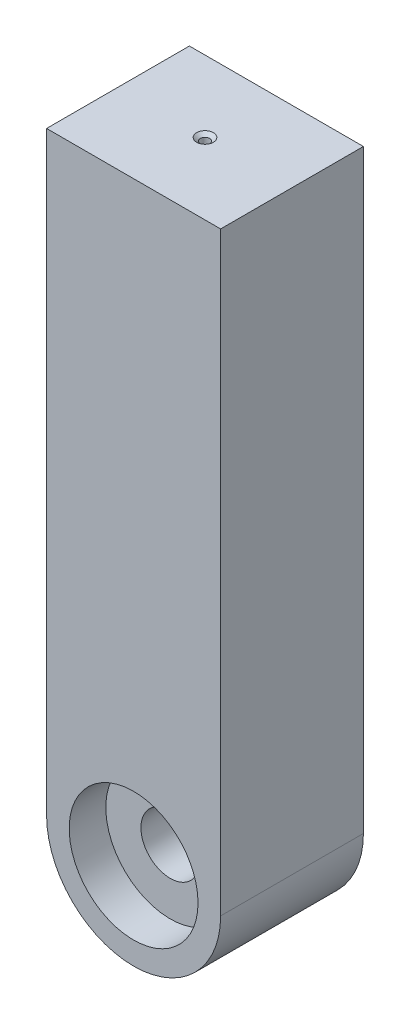
ISO-10303-21;
HEADER;
FILE_DESCRIPTION(('STEP AP214'),'2;1');
FILE_NAME('part.step','',(''),(''),'','','');
FILE_SCHEMA(('AUTOMOTIVE_DESIGN { 1 0 10303 214 1 1 1 1 }'));
ENDSEC;
DATA;
#1=APPLICATION_CONTEXT('core data for automotive mechanical design processes');
#2=APPLICATION_PROTOCOL_DEFINITION('international standard','automotive_design',2000,#1);
#3=PRODUCT_CONTEXT('',#1,'mechanical');
#4=PRODUCT('Part','Part','',(#3));
#5=PRODUCT_RELATED_PRODUCT_CATEGORY('part','',(#4));
#6=PRODUCT_DEFINITION_FORMATION('','',#4);
#7=PRODUCT_DEFINITION_CONTEXT('part definition',#1,'design');
#8=PRODUCT_DEFINITION('design','',#6,#7);
#9=PRODUCT_DEFINITION_SHAPE('','',#8);
#10=(LENGTH_UNIT() NAMED_UNIT(*) SI_UNIT(.MILLI.,.METRE.));
#11=(NAMED_UNIT(*) PLANE_ANGLE_UNIT() SI_UNIT($,.RADIAN.));
#12=(NAMED_UNIT(*) SI_UNIT($,.STERADIAN.) SOLID_ANGLE_UNIT());
#13=UNCERTAINTY_MEASURE_WITH_UNIT(LENGTH_MEASURE(1.E-05),#10,'distance_accuracy_value','');
#14=(GEOMETRIC_REPRESENTATION_CONTEXT(3) GLOBAL_UNCERTAINTY_ASSIGNED_CONTEXT((#13)) GLOBAL_UNIT_ASSIGNED_CONTEXT((#10,
#11,#12)) REPRESENTATION_CONTEXT('',''));
#15=CARTESIAN_POINT('',(0.,0.,0.));
#16=DIRECTION('',(0.,0.,1.));
#17=DIRECTION('',(1.,0.,0.));
#18=AXIS2_PLACEMENT_3D('',#15,#16,#17);
#19=CARTESIAN_POINT('',(0.,101.6,12.192));
#20=DIRECTION('',(0.,1.,0.));
#21=DIRECTION('',(0.,0.,1.));
#22=AXIS2_PLACEMENT_3D('',#19,#20,#21);
#23=CYLINDRICAL_SURFACE('',#22,0.793749999999987);
#24=CARTESIAN_POINT('',(0.,-5.,12.98575));
#25=CARTESIAN_POINT('',(0.0442868029784821,-4.99999926306734,12.9857481986608));
#26=CARTESIAN_POINT('',(0.0885985221211616,-4.9994054564783,12.9820310497521));
#27=CARTESIAN_POINT('',(0.175981215713739,-4.99709380935576,12.9672656689744));
#28=CARTESIAN_POINT('',(0.219050976198928,-4.9953749055386,12.9562105021038));
#29=CARTESIAN_POINT('',(0.30267268659208,-4.99100604152866,12.9271095677171));
#30=CARTESIAN_POINT('',(0.343226590864377,-4.98835681496026,12.909069307288));
#31=CARTESIAN_POINT('',(0.420726054729294,-4.9824193010097,12.8665242415613));
#32=CARTESIAN_POINT('',(0.457672069165868,-4.97913109433995,12.8420202525865));
#33=CARTESIAN_POINT('',(0.527234423973409,-4.97224867448937,12.7870161188729));
#34=CARTESIAN_POINT('',(0.559814786102607,-4.96865227664183,12.7564707418752));
#35=CARTESIAN_POINT('',(0.619410394156614,-4.96157571550642,12.6903482569482));
#36=CARTESIAN_POINT('',(0.646425304338112,-4.95809555924158,12.6547708456729));
#37=CARTESIAN_POINT('',(0.694265348443522,-4.9516243467632,12.5793496646319));
#38=CARTESIAN_POINT('',(0.715055275509961,-4.9486361139986,12.5394832996408));
#39=CARTESIAN_POINT('',(0.749630135676516,-4.94351717276433,12.4567690146025));
#40=CARTESIAN_POINT('',(0.763415497105619,-4.94138641186195,12.4139212770484));
#41=CARTESIAN_POINT('',(0.783477333166421,-4.9382452898346,12.3268404962524));
#42=CARTESIAN_POINT('',(0.789815675405902,-4.93722570262488,12.2826220451723));
#43=CARTESIAN_POINT('',(0.794995293728657,-4.93639441348861,12.1937383475419));
#44=CARTESIAN_POINT('',(0.793837051389764,-4.93658263397293,12.1490731298759));
#45=CARTESIAN_POINT('',(0.784106852683278,-4.93813726351545,12.0610031713785));
#46=CARTESIAN_POINT('',(0.775604104855379,-4.93949267358105,12.0175905619337));
#47=CARTESIAN_POINT('',(0.751534735825031,-4.94321176217252,11.9328160671561));
#48=CARTESIAN_POINT('',(0.735967892954422,-4.94557547233827,11.8914542462212));
#49=CARTESIAN_POINT('',(0.6981411695824,-4.95105684312297,11.8117466020698));
#50=CARTESIAN_POINT('',(0.675852269748302,-4.95417776097461,11.7734147836969));
#51=CARTESIAN_POINT('',(0.625234766456402,-4.96081959279446,11.7010090654152));
#52=CARTESIAN_POINT('',(0.596905719852388,-4.96434053610241,11.6669354782103));
#53=CARTESIAN_POINT('',(0.534633625363303,-4.97143415845861,11.6036125911038));
#54=CARTESIAN_POINT('',(0.500631136816684,-4.97500697463801,11.5744217292329));
#55=CARTESIAN_POINT('',(0.428179153670544,-4.98176516521675,11.5221514983698));
#56=CARTESIAN_POINT('',(0.389729635129998,-4.98495053753005,11.4990721622819));
#57=CARTESIAN_POINT('',(0.309422181041151,-4.99057885874572,11.4596759341335));
#58=CARTESIAN_POINT('',(0.267561829866546,-4.9930212755735,11.4433638855024));
#59=CARTESIAN_POINT('',(0.181648371408792,-4.99688413917557,11.4180178284116));
#60=CARTESIAN_POINT('',(0.137595430628269,-4.99830466342495,11.4089832682007));
#61=CARTESIAN_POINT('',(0.049051306049842,-4.99995334615618,11.3985271274472));
#62=CARTESIAN_POINT('',(0.00456982820783796,-5.0001940776964,11.3970252668241));
#63=CARTESIAN_POINT('',(-0.0840094602803802,-4.99949038456861,11.4014635869319));
#64=CARTESIAN_POINT('',(-0.128107284222778,-4.99854600113888,11.4074035087122));
#65=CARTESIAN_POINT('',(-0.214421859675549,-4.99558596850309,11.4264900139059));
#66=CARTESIAN_POINT('',(-0.256647550118556,-4.99357618335474,11.4395971606598));
#67=CARTESIAN_POINT('',(-0.338302120338383,-4.98870987196136,11.4726042323118));
#68=CARTESIAN_POINT('',(-0.377730855245214,-4.98585330189623,11.4925045087543));
#69=CARTESIAN_POINT('',(-0.453023088407801,-4.979579353419,11.5387189901644));
#70=CARTESIAN_POINT('',(-0.488855204231977,-4.97615763002867,11.5650837221378));
#71=CARTESIAN_POINT('',(-0.555615057584996,-4.96914688382374,11.6234088031002));
#72=CARTESIAN_POINT('',(-0.586542473563198,-4.96555785006026,11.6553695186714));
#73=CARTESIAN_POINT('',(-0.642909933182299,-4.95857671625014,11.7243380949318));
#74=CARTESIAN_POINT('',(-0.668295940548565,-4.95518677241011,11.7613903711135));
#75=CARTESIAN_POINT('',(-0.712483453030662,-4.9490268898755,11.8392805050321));
#76=CARTESIAN_POINT('',(-0.731285152328512,-4.94625693289736,11.8801182510843));
#77=CARTESIAN_POINT('',(-0.761688084633028,-4.94166655509917,11.9642641111424));
#78=CARTESIAN_POINT('',(-0.773316963741087,-4.93984249291804,12.0075620287542));
#79=CARTESIAN_POINT('',(-0.789131654479692,-4.93734102872306,12.0955277267312));
#80=CARTESIAN_POINT('',(-0.793318047755249,-4.93666353710266,12.1401953997698));
#81=CARTESIAN_POINT('',(-0.794113867574299,-4.93653553511373,12.2290935692258));
#82=CARTESIAN_POINT('',(-0.790808301727248,-4.93707125892483,12.273323308051));
#83=CARTESIAN_POINT('',(-0.77689704714873,-4.93927927874747,12.3605890548011));
#84=CARTESIAN_POINT('',(-0.766291375991361,-4.94095157202285,12.4036250655994));
#85=CARTESIAN_POINT('',(-0.738112323915148,-4.94523927738685,12.4872533804455));
#86=CARTESIAN_POINT('',(-0.720545592897981,-4.94785378915875,12.5278479742744));
#87=CARTESIAN_POINT('',(-0.678951663030314,-4.95373231777965,12.6055275528623));
#88=CARTESIAN_POINT('',(-0.654924192928551,-4.95699636189748,12.6426123901773));
#89=CARTESIAN_POINT('',(-0.60078477085828,-4.96385012613323,12.7126504338134));
#90=CARTESIAN_POINT('',(-0.570610068004944,-4.96744297554412,12.745554833778));
#91=CARTESIAN_POINT('',(-0.505165279789628,-4.97452400287837,12.8058626798381));
#92=CARTESIAN_POINT('',(-0.469894016492537,-4.97801215637834,12.8332648507307));
#93=CARTESIAN_POINT('',(-0.394998095552905,-4.984515719289,12.8819443617196));
#94=CARTESIAN_POINT('',(-0.355347758525414,-4.98752805778096,12.9031826016027));
#95=CARTESIAN_POINT('',(-0.273012004638354,-4.99271061784944,12.9386652177304));
#96=CARTESIAN_POINT('',(-0.230329720310809,-4.99488169404344,12.9529166955778));
#97=CARTESIAN_POINT('',(-0.156224017547232,-4.99765265408175,12.9708594879521));
#98=CARTESIAN_POINT('',(-0.125253498577084,-4.99852829409718,12.9764346882159));
#99=CARTESIAN_POINT('',(-0.062859499994009,-4.9997022243396,12.9838805561974));
#100=CARTESIAN_POINT('',(-0.0314360270795058,-5.00000052309568,12.9857512786416));
#101=CARTESIAN_POINT('',(0.,-5.,12.98575));
#102=B_SPLINE_CURVE_WITH_KNOTS('',3,(#24,#25,#26,#27,#28,#29,#30,#31,#32,#33,#34,#35,#36,#37,
#38,#39,#40,#41,#42,#43,#44,#45,#46,#47,#48,#49,#50,#51,#52,#53,#54,#55,#56,#57,#58,#59,#60,#61,
#62,#63,#64,#65,#66,#67,#68,#69,#70,#71,#72,#73,#74,#75,#76,#77,#78,#79,#80,#81,#82,#83,#84,#85,
#86,#87,#88,#89,#90,#91,#92,#93,#94,#95,#96,#97,#98,#99,#100,#101),.UNSPECIFIED.,.T.,.F.,(4,2,2,
2,2,2,2,2,2,2,2,2,2,2,2,2,2,2,2,2,2,2,2,2,2,2,2,2,2,2,2,2,2,2,2,2,2,2,4),(0.,0.132745519460005,
0.265616672799473,0.398383282383931,0.531133132514856,0.664917321698431,0.798709579229842,
0.933244826466915,1.06777184588712,1.20117317017143,1.33456592488884,1.46671524174354,
1.59886870567178,1.73160105152412,1.86434313887627,1.99857506882734,2.13280772146286,
2.2671362809761,2.40145465525721,2.53433843759351,2.66721759612086,2.79937285702921,
2.931534958008,3.06476496522099,3.1980037033454,3.33248878579348,3.46696990172234,
3.60092939599711,3.73487842061173,3.86731520961208,3.9997516797884,4.13206193721059,
4.26437775048781,4.39811879595893,4.53189080172381,4.66649370283955,4.80095950345966,
4.89518742493975,4.98941395437461),.UNSPECIFIED.);
#103=CARTESIAN_POINT('',(0.,-5.,12.98575));
#104=VERTEX_POINT('',#103);
#105=EDGE_CURVE('E49',#104,#104,#102,.T.);
#106=ORIENTED_EDGE('',*,*,#105,.T.);
#107=EDGE_LOOP('',(#106));
#108=FACE_BOUND('',#107,.T.);
#109=CARTESIAN_POINT('',(0.,-14.859,12.98575));
#110=CARTESIAN_POINT('',(0.0445511970712353,-14.8589997168098,12.9857480352709));
#111=CARTESIAN_POINT('',(0.0891338879903263,-14.8587974905379,12.981986580408));
#112=CARTESIAN_POINT('',(0.177069102047054,-14.8580102111898,12.9670348973421));
#113=CARTESIAN_POINT('',(0.220420117744781,-14.8574247084451,12.9558359430736));
#114=CARTESIAN_POINT('',(0.304605448739784,-14.8559371369391,12.9263310722992));
#115=CARTESIAN_POINT('',(0.345441045465724,-14.8550352309573,12.9080288097088));
#116=CARTESIAN_POINT('',(0.42344945176793,-14.8530163948608,12.8648425497807));
#117=CARTESIAN_POINT('',(0.460623116695129,-14.8518995151405,12.8399600944659));
#118=CARTESIAN_POINT('',(0.530305515457104,-14.8495749339762,12.7842885490404));
#119=CARTESIAN_POINT('',(0.562809577475978,-14.8483671433935,12.7534936146116));
#120=CARTESIAN_POINT('',(0.622190243247058,-14.8459976322247,12.6868830582153));
#121=CARTESIAN_POINT('',(0.649066615811434,-14.8448359135328,12.6510672300884));
#122=CARTESIAN_POINT('',(0.69644235562157,-14.8426889009497,12.5754064243521));
#123=CARTESIAN_POINT('',(0.716937998980546,-14.8417037102246,12.5355591118151));
#124=CARTESIAN_POINT('',(0.750946614965515,-14.8400219599996,12.4529828719552));
#125=CARTESIAN_POINT('',(0.764459646125226,-14.8393253980802,12.4102539687914));
#126=CARTESIAN_POINT('',(0.784106905960332,-14.8383002756803,12.3231711098982));
#127=CARTESIAN_POINT('',(0.790248232804472,-14.8379713612155,12.2788187598609));
#128=CARTESIAN_POINT('',(0.794999657996682,-14.8377175630207,12.1897115584332));
#129=CARTESIAN_POINT('',(0.79360982227573,-14.8377926757536,12.14495671057));
#130=CARTESIAN_POINT('',(0.783344280690709,-14.8383381326651,12.0563632161587));
#131=CARTESIAN_POINT('',(0.774476246875198,-14.8388080717806,12.0125236777923));
#132=CARTESIAN_POINT('',(0.749517932059289,-14.840089578661,11.9269563647548));
#133=CARTESIAN_POINT('',(0.733427617325127,-14.8409011480215,11.8852285999484));
#134=CARTESIAN_POINT('',(0.69447273683023,-14.8427749143657,11.8050446316868));
#135=CARTESIAN_POINT('',(0.671604677696429,-14.8438372405363,11.7665901285191));
#136=CARTESIAN_POINT('',(0.61974598973525,-14.8460926592733,11.6940628599385));
#137=CARTESIAN_POINT('',(0.590755311251809,-14.8472857529001,11.6599901300666));
#138=CARTESIAN_POINT('',(0.527431050172803,-14.8496700381682,11.5971489582927));
#139=CARTESIAN_POINT('',(0.493090824900093,-14.8508612255591,11.5683872095455));
#140=CARTESIAN_POINT('',(0.420065593485935,-14.8531060070603,11.5170360289343));
#141=CARTESIAN_POINT('',(0.381380586174206,-14.8541596011335,11.4944465987329));
#142=CARTESIAN_POINT('',(0.300759963974841,-14.8560105139923,11.4560819087557));
#143=CARTESIAN_POINT('',(0.258824235337993,-14.8568078238049,11.4403068875567));
#144=CARTESIAN_POINT('',(0.172894327568359,-14.8580561853521,11.4160232094726));
#145=CARTESIAN_POINT('',(0.128900166017789,-14.8585072400437,11.4075144905339));
#146=CARTESIAN_POINT('',(0.040160321956241,-14.8590118784084,11.3980132086609));
#147=CARTESIAN_POINT('',(-0.00458436677243368,-14.8590659516033,11.3970113888617));
#148=CARTESIAN_POINT('',(-0.0936062001380785,-14.8587718333463,11.4025281785084));
#149=CARTESIAN_POINT('',(-0.137883346543333,-14.8584236434164,11.4090467595012));
#150=CARTESIAN_POINT('',(-0.224687256010351,-14.8573645264691,11.4294116497307));
#151=CARTESIAN_POINT('',(-0.267215014658249,-14.856653808943,11.443253727161));
#152=CARTESIAN_POINT('',(-0.349343625687964,-14.854949638927,11.4778683924215));
#153=CARTESIAN_POINT('',(-0.388944458822206,-14.8539561845781,11.4986410258225));
#154=CARTESIAN_POINT('',(-0.464137572462423,-14.8517970469673,11.5465508102509));
#155=CARTESIAN_POINT('',(-0.499725898041639,-14.8506311963541,11.5736941607768));
#156=CARTESIAN_POINT('',(-0.565843997067253,-14.8482590994123,11.6335658302842));
#157=CARTESIAN_POINT('',(-0.596373733711179,-14.8470528527898,11.6662941898944));
#158=CARTESIAN_POINT('',(-0.651539241288116,-14.844734516992,11.7364466910101));
#159=CARTESIAN_POINT('',(-0.676169018916177,-14.8436225242963,11.7738755490643));
#160=CARTESIAN_POINT('',(-0.718794489504054,-14.8416196140538,11.8523427804158));
#161=CARTESIAN_POINT('',(-0.736790214380717,-14.8407286954434,11.8933811363464));
#162=CARTESIAN_POINT('',(-0.765626314492629,-14.8392690904769,11.9778803100532));
#163=CARTESIAN_POINT('',(-0.776470498207425,-14.8387002326335,12.0213398250711));
#164=CARTESIAN_POINT('',(-0.79070814107026,-14.8379484177082,12.1094658570778));
#165=CARTESIAN_POINT('',(-0.794101650455425,-14.8377654580243,12.1541323659263));
#166=CARTESIAN_POINT('',(-0.793341141664969,-14.8378061351553,12.2433448295803));
#167=CARTESIAN_POINT('',(-0.789196550078404,-14.8380292641461,12.287890865284));
#168=CARTESIAN_POINT('',(-0.773496990108598,-14.838855897578,12.3756536740255));
#169=CARTESIAN_POINT('',(-0.761942007760115,-14.8394594027359,12.418870444558));
#170=CARTESIAN_POINT('',(-0.731751653640593,-14.8409786541034,12.5027497707349));
#171=CARTESIAN_POINT('',(-0.713116251831276,-14.8418944016376,12.5434123155422));
#172=CARTESIAN_POINT('',(-0.669295565083598,-14.8439349041419,12.621032313151));
#173=CARTESIAN_POINT('',(-0.64411047321888,-14.8450596529507,12.6579898751245));
#174=CARTESIAN_POINT('',(-0.587871179070781,-14.8473930110575,12.7271981497815));
#175=CARTESIAN_POINT('',(-0.556810321779103,-14.8486017144521,12.7594434511386));
#176=CARTESIAN_POINT('',(-0.489707168346699,-14.8509660457311,12.8182723411783));
#177=CARTESIAN_POINT('',(-0.453663650302102,-14.8521216605036,12.8448545370151));
#178=CARTESIAN_POINT('',(-0.37758684550084,-14.8542504945204,12.8916168553249));
#179=CARTESIAN_POINT('',(-0.337549496366734,-14.8552235250887,12.9117903700478));
#180=CARTESIAN_POINT('',(-0.254680573220428,-14.8568748114789,12.9451046712004));
#181=CARTESIAN_POINT('',(-0.211852359822105,-14.8575534145576,12.9582537467311));
#182=CARTESIAN_POINT('',(-0.140632555133111,-14.8583603089455,12.9737047881346));
#183=CARTESIAN_POINT('',(-0.112702036502855,-14.8585991358804,12.9782159572599));
#184=CARTESIAN_POINT('',(-0.0565185707780477,-14.8589190711655,12.9842391849825));
#185=CARTESIAN_POINT('',(-0.0282656240004448,-14.8590001796708,12.9857512465275));
#186=CARTESIAN_POINT('',(0.,-14.859,12.98575));
#187=B_SPLINE_CURVE_WITH_KNOTS('',3,(#109,#110,#111,#112,#113,#114,#115,#116,#117,#118,#119,
#120,#121,#122,#123,#124,#125,#126,#127,#128,#129,#130,#131,#132,#133,#134,#135,#136,#137,#138,
#139,#140,#141,#142,#143,#144,#145,#146,#147,#148,#149,#150,#151,#152,#153,#154,#155,#156,#157,
#158,#159,#160,#161,#162,#163,#164,#165,#166,#167,#168,#169,#170,#171,#172,#173,#174,#175,#176,
#177,#178,#179,#180,#181,#182,#183,#184,#185,#186),.UNSPECIFIED.,.T.,.F.,(4,2,2,2,2,2,2,2,2,2,2,
2,2,2,2,2,2,2,2,2,2,2,2,2,2,2,2,2,2,2,2,2,2,2,2,2,2,2,4),(0.,0.133550409586135,
0.267257785000665,0.400896472801889,0.534503871004874,0.66824402267479,0.80198966736848,
0.935813222278427,1.06963565535645,1.20332912800405,1.33702143024444,1.47057674123047,
1.60413267603194,1.73775756806276,1.87138354386841,2.00517678907693,2.13897007032318,
2.27276803537794,2.40656485779863,2.54019666624707,2.67382796910757,2.80738213870336,
2.94093718647846,3.07462274272659,3.2083092715271,3.3421310314945,3.47595214762859,
3.60970194103503,3.74345083261359,3.87703258274972,4.01061458462792,4.14419715322651,
4.2777757844861,4.41150662535098,4.54527031955995,4.67917148818736,4.81291429743225,
4.89764578886334,4.98237719701004),.UNSPECIFIED.);
#188=CARTESIAN_POINT('',(0.,-14.859,12.98575));
#189=VERTEX_POINT('',#188);
#190=EDGE_CURVE('E127',#189,#189,#187,.T.);
#191=ORIENTED_EDGE('',*,*,#190,.F.);
#192=EDGE_LOOP('',(#191));
#193=FACE_BOUND('',#192,.T.);
#194=ADVANCED_FACE('F45',(#108,#193),#23,.F.);
#195=CARTESIAN_POINT('',(-14.859,101.6,24.384));
#196=DIRECTION('',(0.,-1.,0.));
#197=DIRECTION('',(0.,0.,-1.));
#198=AXIS2_PLACEMENT_3D('',#195,#196,#197);
#199=PLANE('',#198);
#200=DIRECTION('',(-1.,0.,0.));
#201=VECTOR('',#200,1.);
#202=CARTESIAN_POINT('',(-14.859,101.6,0.));
#203=LINE('',#202,#201);
#204=CARTESIAN_POINT('',(14.859,101.6,0.));
#205=VERTEX_POINT('',#204);
#206=CARTESIAN_POINT('',(-14.859,101.6,0.));
#207=VERTEX_POINT('',#206);
#208=EDGE_CURVE('E87',#205,#207,#203,.T.);
#209=ORIENTED_EDGE('',*,*,#208,.T.);
#210=DIRECTION('',(0.,0.,-1.));
#211=VECTOR('',#210,1.);
#212=CARTESIAN_POINT('',(-14.859,101.6,24.384));
#213=LINE('',#212,#211);
#214=CARTESIAN_POINT('',(-14.859,101.6,24.384));
#215=VERTEX_POINT('',#214);
#216=EDGE_CURVE('E112',#215,#207,#213,.T.);
#217=ORIENTED_EDGE('',*,*,#216,.F.);
#218=DIRECTION('',(-1.,0.,0.));
#219=VECTOR('',#218,1.);
#220=CARTESIAN_POINT('',(-14.859,101.6,24.384));
#221=LINE('',#220,#219);
#222=CARTESIAN_POINT('',(14.859,101.6,24.384));
#223=VERTEX_POINT('',#222);
#224=EDGE_CURVE('E103',#223,#215,#221,.T.);
#225=ORIENTED_EDGE('',*,*,#224,.F.);
#226=DIRECTION('',(0.,0.,-1.));
#227=VECTOR('',#226,1.);
#228=CARTESIAN_POINT('',(14.859,101.6,24.384));
#229=LINE('',#228,#227);
#230=EDGE_CURVE('E61',#223,#205,#229,.T.);
#231=ORIENTED_EDGE('',*,*,#230,.T.);
#232=EDGE_LOOP('',(#209,#217,#225,#231));
#233=FACE_BOUND('',#232,.T.);
#234=CARTESIAN_POINT('',(0.,101.6,12.192));
#235=DIRECTION('',(0.,1.,0.));
#236=DIRECTION('',(0.,0.,1.));
#237=AXIS2_PLACEMENT_3D('',#234,#235,#236);
#238=CIRCLE('',#237,1.42875);
#239=CARTESIAN_POINT('',(0.,101.6,13.62075));
#240=VERTEX_POINT('',#239);
#241=EDGE_CURVE('E191',#240,#240,#238,.T.);
#242=ORIENTED_EDGE('',*,*,#241,.F.);
#243=EDGE_LOOP('',(#242));
#244=FACE_BOUND('',#243,.T.);
#245=ADVANCED_FACE('F114',(#233,#244),#199,.F.);
#246=CARTESIAN_POINT('',(0.,0.,24.384));
#247=DIRECTION('',(0.,0.,-1.));
#248=DIRECTION('',(-1.,0.,0.));
#249=AXIS2_PLACEMENT_3D('',#246,#247,#248);
#250=CYLINDRICAL_SURFACE('',#249,14.859);
#251=ORIENTED_EDGE('',*,*,#190,.T.);
#252=EDGE_LOOP('',(#251));
#253=FACE_BOUND('',#252,.T.);
#254=CARTESIAN_POINT('',(0.,0.,0.));
#255=DIRECTION('',(0.,0.,1.));
#256=DIRECTION('',(1.,0.,0.));
#257=AXIS2_PLACEMENT_3D('',#254,#255,#256);
#258=CIRCLE('',#257,14.859);
#259=CARTESIAN_POINT('',(-14.859,0.,0.));
#260=VERTEX_POINT('',#259);
#261=CARTESIAN_POINT('',(14.859,0.,0.));
#262=VERTEX_POINT('',#261);
#263=EDGE_CURVE('E123',#260,#262,#258,.T.);
#264=ORIENTED_EDGE('',*,*,#263,.T.);
#265=DIRECTION('',(0.,0.,-1.));
#266=VECTOR('',#265,1.);
#267=CARTESIAN_POINT('',(14.859,0.,24.384));
#268=LINE('',#267,#266);
#269=CARTESIAN_POINT('',(14.859,0.,24.384));
#270=VERTEX_POINT('',#269);
#271=EDGE_CURVE('E11',#270,#262,#268,.T.);
#272=ORIENTED_EDGE('',*,*,#271,.F.);
#273=CARTESIAN_POINT('',(0.,0.,24.384));
#274=DIRECTION('',(0.,0.,1.));
#275=DIRECTION('',(1.,0.,0.));
#276=AXIS2_PLACEMENT_3D('',#273,#274,#275);
#277=CIRCLE('',#276,14.859);
#278=CARTESIAN_POINT('',(-14.859,0.,24.384));
#279=VERTEX_POINT('',#278);
#280=EDGE_CURVE('E105',#279,#270,#277,.T.);
#281=ORIENTED_EDGE('',*,*,#280,.F.);
#282=DIRECTION('',(0.,0.,-1.));
#283=VECTOR('',#282,1.);
#284=CARTESIAN_POINT('',(-14.859,0.,24.384));
#285=LINE('',#284,#283);
#286=EDGE_CURVE('E119',#279,#260,#285,.T.);
#287=ORIENTED_EDGE('',*,*,#286,.T.);
#288=EDGE_LOOP('',(#264,#272,#281,#287));
#289=FACE_BOUND('',#288,.T.);
#290=ADVANCED_FACE('F47',(#253,#289),#250,.T.);
#291=CARTESIAN_POINT('',(14.859,0.,24.384));
#292=DIRECTION('',(-1.,0.,0.));
#293=DIRECTION('',(0.,-1.,0.));
#294=AXIS2_PLACEMENT_3D('',#291,#292,#293);
#295=PLANE('',#294);
#296=DIRECTION('',(0.,1.,0.));
#297=VECTOR('',#296,1.);
#298=CARTESIAN_POINT('',(14.859,0.,0.));
#299=LINE('',#298,#297);
#300=EDGE_CURVE('E110',#262,#205,#299,.T.);
#301=ORIENTED_EDGE('',*,*,#300,.T.);
#302=ORIENTED_EDGE('',*,*,#230,.F.);
#303=DIRECTION('',(0.,1.,0.));
#304=VECTOR('',#303,1.);
#305=CARTESIAN_POINT('',(14.859,0.,24.384));
#306=LINE('',#305,#304);
#307=EDGE_CURVE('E100',#270,#223,#306,.T.);
#308=ORIENTED_EDGE('',*,*,#307,.F.);
#309=ORIENTED_EDGE('',*,*,#271,.T.);
#310=EDGE_LOOP('',(#301,#302,#308,#309));
#311=FACE_BOUND('',#310,.T.);
#312=ADVANCED_FACE('F109',(#311),#295,.F.);
#313=CARTESIAN_POINT('',(-14.859,0.,24.384));
#314=DIRECTION('',(1.,0.,0.));
#315=DIRECTION('',(0.,1.,0.));
#316=AXIS2_PLACEMENT_3D('',#313,#314,#315);
#317=PLANE('',#316);
#318=DIRECTION('',(0.,-1.,0.));
#319=VECTOR('',#318,1.);
#320=CARTESIAN_POINT('',(-14.859,0.,0.));
#321=LINE('',#320,#319);
#322=EDGE_CURVE('E93',#207,#260,#321,.T.);
#323=ORIENTED_EDGE('',*,*,#322,.T.);
#324=ORIENTED_EDGE('',*,*,#286,.F.);
#325=DIRECTION('',(0.,-1.,0.));
#326=VECTOR('',#325,1.);
#327=CARTESIAN_POINT('',(-14.859,0.,24.384));
#328=LINE('',#327,#326);
#329=EDGE_CURVE('E70',#215,#279,#328,.T.);
#330=ORIENTED_EDGE('',*,*,#329,.F.);
#331=ORIENTED_EDGE('',*,*,#216,.T.);
#332=EDGE_LOOP('',(#323,#324,#330,#331));
#333=FACE_BOUND('',#332,.T.);
#334=ADVANCED_FACE('F200',(#333),#317,.F.);
#335=CARTESIAN_POINT('',(0.,0.,24.384));
#336=DIRECTION('',(0.,0.,1.));
#337=DIRECTION('',(1.,0.,0.));
#338=AXIS2_PLACEMENT_3D('',#335,#336,#337);
#339=PLANE('',#338);
#340=CARTESIAN_POINT('',(0.,0.,24.384));
#341=DIRECTION('',(0.,0.,1.));
#342=DIRECTION('',(1.,0.,0.));
#343=AXIS2_PLACEMENT_3D('',#340,#341,#342);
#344=CIRCLE('',#343,11.);
#345=CARTESIAN_POINT('',(11.,0.,24.384));
#346=VERTEX_POINT('',#345);
#347=EDGE_CURVE('E283',#346,#346,#344,.T.);
#348=ORIENTED_EDGE('',*,*,#347,.F.);
#349=EDGE_LOOP('',(#348));
#350=FACE_BOUND('',#349,.T.);
#351=ORIENTED_EDGE('',*,*,#280,.T.);
#352=ORIENTED_EDGE('',*,*,#307,.T.);
#353=ORIENTED_EDGE('',*,*,#224,.T.);
#354=ORIENTED_EDGE('',*,*,#329,.T.);
#355=EDGE_LOOP('',(#351,#352,#353,#354));
#356=FACE_BOUND('',#355,.T.);
#357=ADVANCED_FACE('F101',(#350,#356),#339,.T.);
#358=CARTESIAN_POINT('',(0.,0.,0.));
#359=DIRECTION('',(0.,0.,1.));
#360=DIRECTION('',(1.,0.,0.));
#361=AXIS2_PLACEMENT_3D('',#358,#359,#360);
#362=PLANE('',#361);
#363=CARTESIAN_POINT('',(0.,0.,0.));
#364=DIRECTION('',(0.,0.,1.));
#365=DIRECTION('',(1.,0.,0.));
#366=AXIS2_PLACEMENT_3D('',#363,#364,#365);
#367=CIRCLE('',#366,5.);
#368=CARTESIAN_POINT('',(5.,0.,0.));
#369=VERTEX_POINT('',#368);
#370=EDGE_CURVE('E280',#369,#369,#367,.T.);
#371=ORIENTED_EDGE('',*,*,#370,.T.);
#372=EDGE_LOOP('',(#371));
#373=FACE_BOUND('',#372,.T.);
#374=ORIENTED_EDGE('',*,*,#263,.F.);
#375=ORIENTED_EDGE('',*,*,#322,.F.);
#376=ORIENTED_EDGE('',*,*,#208,.F.);
#377=ORIENTED_EDGE('',*,*,#300,.F.);
#378=EDGE_LOOP('',(#374,#375,#376,#377));
#379=FACE_BOUND('',#378,.T.);
#380=ADVANCED_FACE('F169',(#373,#379),#362,.F.);
#381=CARTESIAN_POINT('',(0.,5.,12.98575));
#382=CARTESIAN_POINT('',(-0.0442868029784821,4.99999926306734,12.9857481986608));
#383=CARTESIAN_POINT('',(-0.0885985221211616,4.9994054564783,12.9820310497521));
#384=CARTESIAN_POINT('',(-0.175981215713739,4.99709380935576,12.9672656689744));
#385=CARTESIAN_POINT('',(-0.219050976198928,4.9953749055386,12.9562105021038));
#386=CARTESIAN_POINT('',(-0.30267268659208,4.99100604152866,12.9271095677171));
#387=CARTESIAN_POINT('',(-0.343226590864377,4.98835681496026,12.909069307288));
#388=CARTESIAN_POINT('',(-0.420726054729294,4.9824193010097,12.8665242415613));
#389=CARTESIAN_POINT('',(-0.457672069165868,4.97913109433995,12.8420202525865));
#390=CARTESIAN_POINT('',(-0.527234423973409,4.97224867448937,12.7870161188729));
#391=CARTESIAN_POINT('',(-0.559814786102607,4.96865227664183,12.7564707418752));
#392=CARTESIAN_POINT('',(-0.619410394156614,4.96157571550642,12.6903482569482));
#393=CARTESIAN_POINT('',(-0.646425304338112,4.95809555924158,12.6547708456729));
#394=CARTESIAN_POINT('',(-0.694265348443522,4.9516243467632,12.5793496646319));
#395=CARTESIAN_POINT('',(-0.715055275509961,4.9486361139986,12.5394832996408));
#396=CARTESIAN_POINT('',(-0.749630135676516,4.94351717276433,12.4567690146025));
#397=CARTESIAN_POINT('',(-0.763415497105619,4.94138641186195,12.4139212770484));
#398=CARTESIAN_POINT('',(-0.783477333166421,4.9382452898346,12.3268404962524));
#399=CARTESIAN_POINT('',(-0.789815675405902,4.93722570262488,12.2826220451723));
#400=CARTESIAN_POINT('',(-0.794995293728657,4.93639441348861,12.1937383475419));
#401=CARTESIAN_POINT('',(-0.793837051389764,4.93658263397293,12.1490731298759));
#402=CARTESIAN_POINT('',(-0.784106852683278,4.93813726351545,12.0610031713785));
#403=CARTESIAN_POINT('',(-0.775604104855379,4.93949267358105,12.0175905619337));
#404=CARTESIAN_POINT('',(-0.751534735825031,4.94321176217252,11.9328160671561));
#405=CARTESIAN_POINT('',(-0.735967892954422,4.94557547233827,11.8914542462212));
#406=CARTESIAN_POINT('',(-0.6981411695824,4.95105684312297,11.8117466020698));
#407=CARTESIAN_POINT('',(-0.675852269748302,4.95417776097461,11.7734147836969));
#408=CARTESIAN_POINT('',(-0.625234766456402,4.96081959279446,11.7010090654152));
#409=CARTESIAN_POINT('',(-0.596905719852388,4.96434053610241,11.6669354782103));
#410=CARTESIAN_POINT('',(-0.534633625363303,4.97143415845861,11.6036125911038));
#411=CARTESIAN_POINT('',(-0.500631136816684,4.97500697463801,11.5744217292329));
#412=CARTESIAN_POINT('',(-0.428179153670544,4.98176516521675,11.5221514983698));
#413=CARTESIAN_POINT('',(-0.389729635129998,4.98495053753005,11.4990721622819));
#414=CARTESIAN_POINT('',(-0.309422181041151,4.99057885874572,11.4596759341335));
#415=CARTESIAN_POINT('',(-0.267561829866546,4.9930212755735,11.4433638855024));
#416=CARTESIAN_POINT('',(-0.181648371408792,4.99688413917557,11.4180178284116));
#417=CARTESIAN_POINT('',(-0.137595430628269,4.99830466342495,11.4089832682007));
#418=CARTESIAN_POINT('',(-0.049051306049842,4.99995334615618,11.3985271274472));
#419=CARTESIAN_POINT('',(-0.00456982820783796,5.0001940776964,11.3970252668241));
#420=CARTESIAN_POINT('',(0.0840094602803802,4.99949038456861,11.4014635869319));
#421=CARTESIAN_POINT('',(0.128107284222778,4.99854600113888,11.4074035087122));
#422=CARTESIAN_POINT('',(0.214421859675549,4.99558596850309,11.4264900139059));
#423=CARTESIAN_POINT('',(0.256647550118556,4.99357618335474,11.4395971606598));
#424=CARTESIAN_POINT('',(0.338302120338383,4.98870987196136,11.4726042323118));
#425=CARTESIAN_POINT('',(0.377730855245214,4.98585330189623,11.4925045087543));
#426=CARTESIAN_POINT('',(0.453023088407801,4.979579353419,11.5387189901644));
#427=CARTESIAN_POINT('',(0.488855204231977,4.97615763002867,11.5650837221378));
#428=CARTESIAN_POINT('',(0.555615057584996,4.96914688382374,11.6234088031002));
#429=CARTESIAN_POINT('',(0.586542473563198,4.96555785006026,11.6553695186714));
#430=CARTESIAN_POINT('',(0.642909933182299,4.95857671625014,11.7243380949318));
#431=CARTESIAN_POINT('',(0.668295940548565,4.95518677241011,11.7613903711135));
#432=CARTESIAN_POINT('',(0.712483453030662,4.9490268898755,11.8392805050321));
#433=CARTESIAN_POINT('',(0.731285152328512,4.94625693289736,11.8801182510843));
#434=CARTESIAN_POINT('',(0.761688084633028,4.94166655509917,11.9642641111424));
#435=CARTESIAN_POINT('',(0.773316963741087,4.93984249291804,12.0075620287542));
#436=CARTESIAN_POINT('',(0.789131654479692,4.93734102872306,12.0955277267312));
#437=CARTESIAN_POINT('',(0.793318047755249,4.93666353710266,12.1401953997698));
#438=CARTESIAN_POINT('',(0.794113867574299,4.93653553511373,12.2290935692258));
#439=CARTESIAN_POINT('',(0.790808301727248,4.93707125892483,12.273323308051));
#440=CARTESIAN_POINT('',(0.77689704714873,4.93927927874747,12.3605890548011));
#441=CARTESIAN_POINT('',(0.766291375991361,4.94095157202285,12.4036250655994));
#442=CARTESIAN_POINT('',(0.738112323915148,4.94523927738685,12.4872533804455));
#443=CARTESIAN_POINT('',(0.720545592897981,4.94785378915875,12.5278479742744));
#444=CARTESIAN_POINT('',(0.678951663030314,4.95373231777965,12.6055275528623));
#445=CARTESIAN_POINT('',(0.654924192928551,4.95699636189748,12.6426123901773));
#446=CARTESIAN_POINT('',(0.60078477085828,4.96385012613323,12.7126504338134));
#447=CARTESIAN_POINT('',(0.570610068004944,4.96744297554412,12.745554833778));
#448=CARTESIAN_POINT('',(0.505165279789628,4.97452400287837,12.8058626798381));
#449=CARTESIAN_POINT('',(0.469894016492537,4.97801215637834,12.8332648507307));
#450=CARTESIAN_POINT('',(0.394998095552905,4.984515719289,12.8819443617196));
#451=CARTESIAN_POINT('',(0.355347758525414,4.98752805778096,12.9031826016027));
#452=CARTESIAN_POINT('',(0.273012004638354,4.99271061784944,12.9386652177304));
#453=CARTESIAN_POINT('',(0.230329720310809,4.99488169404344,12.9529166955778));
#454=CARTESIAN_POINT('',(0.156224017547232,4.99765265408175,12.9708594879521));
#455=CARTESIAN_POINT('',(0.125253498577084,4.99852829409718,12.9764346882159));
#456=CARTESIAN_POINT('',(0.062859499994009,4.9997022243396,12.9838805561974));
#457=CARTESIAN_POINT('',(0.0314360270795058,5.00000052309568,12.9857512786416));
#458=CARTESIAN_POINT('',(0.,5.,12.98575));
#459=B_SPLINE_CURVE_WITH_KNOTS('',3,(#381,#382,#383,#384,#385,#386,#387,#388,#389,#390,#391,
#392,#393,#394,#395,#396,#397,#398,#399,#400,#401,#402,#403,#404,#405,#406,#407,#408,#409,#410,
#411,#412,#413,#414,#415,#416,#417,#418,#419,#420,#421,#422,#423,#424,#425,#426,#427,#428,#429,
#430,#431,#432,#433,#434,#435,#436,#437,#438,#439,#440,#441,#442,#443,#444,#445,#446,#447,#448,
#449,#450,#451,#452,#453,#454,#455,#456,#457,#458),.UNSPECIFIED.,.T.,.F.,(4,2,2,2,2,2,2,2,2,2,2,
2,2,2,2,2,2,2,2,2,2,2,2,2,2,2,2,2,2,2,2,2,2,2,2,2,2,2,4),(0.,0.132745519460005,
0.265616672799473,0.398383282383931,0.531133132514856,0.664917321698431,0.798709579229842,
0.933244826466915,1.06777184588712,1.20117317017143,1.33456592488884,1.46671524174354,
1.59886870567178,1.73160105152412,1.86434313887627,1.99857506882734,2.13280772146286,
2.2671362809761,2.40145465525721,2.53433843759351,2.66721759612086,2.79937285702921,
2.931534958008,3.06476496522099,3.1980037033454,3.33248878579348,3.46696990172234,
3.60092939599711,3.73487842061173,3.86731520961208,3.9997516797884,4.13206193721059,
4.26437775048781,4.39811879595893,4.53189080172381,4.66649370283955,4.80095950345966,
4.89518742493975,4.98941395437461),.UNSPECIFIED.);
#460=CARTESIAN_POINT('',(0.,5.,12.98575));
#461=VERTEX_POINT('',#460);
#462=EDGE_CURVE('E137',#461,#461,#459,.T.);
#463=ORIENTED_EDGE('',*,*,#462,.T.);
#464=EDGE_LOOP('',(#463));
#465=FACE_BOUND('',#464,.T.);
#466=CARTESIAN_POINT('',(0.,101.067171734202,12.192));
#467=DIRECTION('',(0.,1.,0.));
#468=DIRECTION('',(0.,0.,1.));
#469=AXIS2_PLACEMENT_3D('',#466,#467,#468);
#470=CIRCLE('',#469,0.79375);
#471=CARTESIAN_POINT('',(0.,101.067171734202,12.98575));
#472=VERTEX_POINT('',#471);
#473=EDGE_CURVE('E187',#472,#472,#470,.T.);
#474=ORIENTED_EDGE('',*,*,#473,.T.);
#475=EDGE_LOOP('',(#474));
#476=FACE_BOUND('',#475,.T.);
#477=ADVANCED_FACE('F144',(#465,#476),#23,.F.);
#478=CARTESIAN_POINT('',(0.,101.6,12.192));
#479=DIRECTION('',(0.,1.,0.));
#480=DIRECTION('',(0.,0.,1.));
#481=AXIS2_PLACEMENT_3D('',#478,#479,#480);
#482=CONICAL_SURFACE('',#481,1.42875,0.872664625997161);
#483=ORIENTED_EDGE('',*,*,#473,.F.);
#484=EDGE_LOOP('',(#483));
#485=FACE_BOUND('',#484,.T.);
#486=ORIENTED_EDGE('',*,*,#241,.T.);
#487=EDGE_LOOP('',(#486));
#488=FACE_BOUND('',#487,.T.);
#489=ADVANCED_FACE('F160',(#485,#488),#482,.F.);
#490=CARTESIAN_POINT('',(0.,0.,18.134));
#491=DIRECTION('',(0.,0.,1.));
#492=DIRECTION('',(1.,0.,0.));
#493=AXIS2_PLACEMENT_3D('',#490,#491,#492);
#494=CYLINDRICAL_SURFACE('',#493,11.);
#495=CARTESIAN_POINT('',(0.,0.,18.134));
#496=DIRECTION('',(0.,0.,1.));
#497=DIRECTION('',(1.,0.,0.));
#498=AXIS2_PLACEMENT_3D('',#495,#496,#497);
#499=CIRCLE('',#498,11.);
#500=CARTESIAN_POINT('',(11.,0.,18.134));
#501=VERTEX_POINT('',#500);
#502=EDGE_CURVE('E288',#501,#501,#499,.T.);
#503=ORIENTED_EDGE('',*,*,#502,.F.);
#504=EDGE_LOOP('',(#503));
#505=FACE_BOUND('',#504,.T.);
#506=ORIENTED_EDGE('',*,*,#347,.T.);
#507=EDGE_LOOP('',(#506));
#508=FACE_BOUND('',#507,.T.);
#509=ADVANCED_FACE('F157',(#505,#508),#494,.F.);
#510=CARTESIAN_POINT('',(0.,0.,18.134));
#511=DIRECTION('',(0.,0.,1.));
#512=DIRECTION('',(1.,0.,0.));
#513=AXIS2_PLACEMENT_3D('',#510,#511,#512);
#514=PLANE('',#513);
#515=CARTESIAN_POINT('',(0.,0.,18.134));
#516=DIRECTION('',(0.,0.,1.));
#517=DIRECTION('',(1.,0.,0.));
#518=AXIS2_PLACEMENT_3D('',#515,#516,#517);
#519=CIRCLE('',#518,5.);
#520=CARTESIAN_POINT('',(5.,0.,18.134));
#521=VERTEX_POINT('',#520);
#522=EDGE_CURVE('E143',#521,#521,#519,.T.);
#523=ORIENTED_EDGE('',*,*,#522,.F.);
#524=EDGE_LOOP('',(#523));
#525=FACE_BOUND('',#524,.T.);
#526=ORIENTED_EDGE('',*,*,#502,.T.);
#527=EDGE_LOOP('',(#526));
#528=FACE_BOUND('',#527,.T.);
#529=ADVANCED_FACE('F152',(#525,#528),#514,.T.);
#530=CARTESIAN_POINT('',(0.,0.,-14.866));
#531=DIRECTION('',(0.,0.,1.));
#532=DIRECTION('',(1.,0.,0.));
#533=AXIS2_PLACEMENT_3D('',#530,#531,#532);
#534=CYLINDRICAL_SURFACE('',#533,5.);
#535=ORIENTED_EDGE('',*,*,#105,.F.);
#536=EDGE_LOOP('',(#535));
#537=FACE_BOUND('',#536,.T.);
#538=ORIENTED_EDGE('',*,*,#522,.T.);
#539=EDGE_LOOP('',(#538));
#540=FACE_BOUND('',#539,.T.);
#541=ORIENTED_EDGE('',*,*,#462,.F.);
#542=EDGE_LOOP('',(#541));
#543=FACE_BOUND('',#542,.T.);
#544=ORIENTED_EDGE('',*,*,#370,.F.);
#545=EDGE_LOOP('',(#544));
#546=FACE_BOUND('',#545,.T.);
#547=ADVANCED_FACE('F148',(#537,#540,#543,#546),#534,.F.);
#548=CLOSED_SHELL('',(#194,#245,#290,#312,#334,#357,#380,#477,#489,#509,#529,#547));
#549=MANIFOLD_SOLID_BREP('B2',#548);
#550=ADVANCED_BREP_SHAPE_REPRESENTATION('',(#18,#549),#14);
#551=SHAPE_DEFINITION_REPRESENTATION(#9,#550);
ENDSEC;
END-ISO-10303-21;
